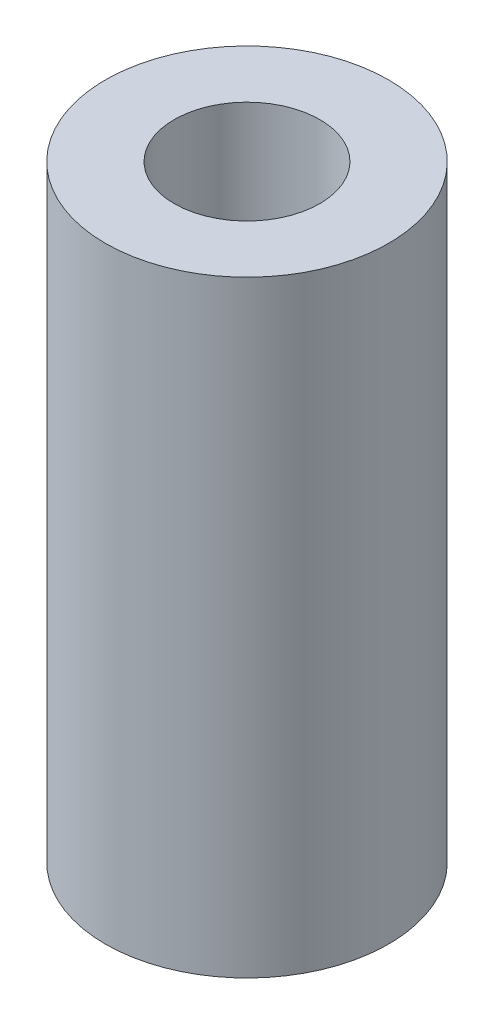
ISO-10303-21;
HEADER;
FILE_DESCRIPTION(('STEP AP214'),'2;1');
FILE_NAME('part.step','',(''),(''),'','','');
FILE_SCHEMA(('AUTOMOTIVE_DESIGN { 1 0 10303 214 1 1 1 1 }'));
ENDSEC;
DATA;
#1=APPLICATION_CONTEXT('core data for automotive mechanical design processes');
#2=APPLICATION_PROTOCOL_DEFINITION('international standard','automotive_design',2000,#1);
#3=PRODUCT_CONTEXT('',#1,'mechanical');
#4=PRODUCT('Part','Part','',(#3));
#5=PRODUCT_RELATED_PRODUCT_CATEGORY('part','',(#4));
#6=PRODUCT_DEFINITION_FORMATION('','',#4);
#7=PRODUCT_DEFINITION_CONTEXT('part definition',#1,'design');
#8=PRODUCT_DEFINITION('design','',#6,#7);
#9=PRODUCT_DEFINITION_SHAPE('','',#8);
#10=(LENGTH_UNIT() NAMED_UNIT(*) SI_UNIT(.MILLI.,.METRE.));
#11=(NAMED_UNIT(*) PLANE_ANGLE_UNIT() SI_UNIT($,.RADIAN.));
#12=(NAMED_UNIT(*) SI_UNIT($,.STERADIAN.) SOLID_ANGLE_UNIT());
#13=UNCERTAINTY_MEASURE_WITH_UNIT(LENGTH_MEASURE(1.E-05),#10,'distance_accuracy_value','');
#14=(GEOMETRIC_REPRESENTATION_CONTEXT(3) GLOBAL_UNCERTAINTY_ASSIGNED_CONTEXT((#13)) GLOBAL_UNIT_ASSIGNED_CONTEXT((#10,
#11,#12)) REPRESENTATION_CONTEXT('',''));
#15=CARTESIAN_POINT('',(0.,0.,0.));
#16=DIRECTION('',(0.,0.,1.));
#17=DIRECTION('',(1.,0.,0.));
#18=AXIS2_PLACEMENT_3D('',#15,#16,#17);
#19=CARTESIAN_POINT('',(0.,7.5,0.));
#20=DIRECTION('',(0.,1.,0.));
#21=DIRECTION('',(0.,0.,1.));
#22=AXIS2_PLACEMENT_3D('',#19,#20,#21);
#23=PLANE('',#22);
#24=CARTESIAN_POINT('',(0.,7.5,0.));
#25=DIRECTION('',(0.,1.,0.));
#26=DIRECTION('',(0.,0.,1.));
#27=AXIS2_PLACEMENT_3D('',#24,#25,#26);
#28=CIRCLE('',#27,3.5);
#29=CARTESIAN_POINT('',(0.,7.5,3.5));
#30=VERTEX_POINT('',#29);
#31=EDGE_CURVE('E10',#30,#30,#28,.T.);
#32=ORIENTED_EDGE('',*,*,#31,.T.);
#33=EDGE_LOOP('',(#32));
#34=FACE_BOUND('',#33,.T.);
#35=CARTESIAN_POINT('',(0.,7.5,0.));
#36=DIRECTION('',(0.,1.,0.));
#37=DIRECTION('',(0.,0.,1.));
#38=AXIS2_PLACEMENT_3D('',#35,#36,#37);
#39=CIRCLE('',#38,1.8);
#40=CARTESIAN_POINT('',(0.,7.5,1.8));
#41=VERTEX_POINT('',#40);
#42=EDGE_CURVE('E43',#41,#41,#39,.T.);
#43=ORIENTED_EDGE('',*,*,#42,.F.);
#44=EDGE_LOOP('',(#43));
#45=FACE_BOUND('',#44,.T.);
#46=ADVANCED_FACE('F32',(#34,#45),#23,.T.);
#47=CARTESIAN_POINT('',(0.,-7.5,0.));
#48=DIRECTION('',(0.,1.,0.));
#49=DIRECTION('',(0.,0.,1.));
#50=AXIS2_PLACEMENT_3D('',#47,#48,#49);
#51=PLANE('',#50);
#52=CARTESIAN_POINT('',(0.,-7.5,0.));
#53=DIRECTION('',(0.,1.,0.));
#54=DIRECTION('',(0.,0.,1.));
#55=AXIS2_PLACEMENT_3D('',#52,#53,#54);
#56=CIRCLE('',#55,3.5);
#57=CARTESIAN_POINT('',(0.,-7.5,3.5));
#58=VERTEX_POINT('',#57);
#59=EDGE_CURVE('E36',#58,#58,#56,.T.);
#60=ORIENTED_EDGE('',*,*,#59,.F.);
#61=EDGE_LOOP('',(#60));
#62=FACE_BOUND('',#61,.T.);
#63=CARTESIAN_POINT('',(0.,-7.5,0.));
#64=DIRECTION('',(0.,1.,0.));
#65=DIRECTION('',(0.,0.,1.));
#66=AXIS2_PLACEMENT_3D('',#63,#64,#65);
#67=CIRCLE('',#66,1.8);
#68=CARTESIAN_POINT('',(0.,-7.5,1.8));
#69=VERTEX_POINT('',#68);
#70=EDGE_CURVE('E45',#69,#69,#67,.T.);
#71=ORIENTED_EDGE('',*,*,#70,.T.);
#72=EDGE_LOOP('',(#71));
#73=FACE_BOUND('',#72,.T.);
#74=ADVANCED_FACE('F55',(#62,#73),#51,.F.);
#75=CARTESIAN_POINT('',(0.,7.5,0.));
#76=DIRECTION('',(0.,-1.,0.));
#77=DIRECTION('',(0.,0.,-1.));
#78=AXIS2_PLACEMENT_3D('',#75,#76,#77);
#79=CYLINDRICAL_SURFACE('',#78,3.5);
#80=ORIENTED_EDGE('',*,*,#31,.F.);
#81=EDGE_LOOP('',(#80));
#82=FACE_BOUND('',#81,.T.);
#83=ORIENTED_EDGE('',*,*,#59,.T.);
#84=EDGE_LOOP('',(#83));
#85=FACE_BOUND('',#84,.T.);
#86=ADVANCED_FACE('F34',(#82,#85),#79,.T.);
#87=CARTESIAN_POINT('',(0.,7.5,0.));
#88=DIRECTION('',(0.,-1.,0.));
#89=DIRECTION('',(0.,0.,-1.));
#90=AXIS2_PLACEMENT_3D('',#87,#88,#89);
#91=CYLINDRICAL_SURFACE('',#90,1.8);
#92=ORIENTED_EDGE('',*,*,#42,.T.);
#93=EDGE_LOOP('',(#92));
#94=FACE_BOUND('',#93,.T.);
#95=ORIENTED_EDGE('',*,*,#70,.F.);
#96=EDGE_LOOP('',(#95));
#97=FACE_BOUND('',#96,.T.);
#98=ADVANCED_FACE('F51',(#94,#97),#91,.F.);
#99=CLOSED_SHELL('',(#46,#74,#86,#98));
#100=MANIFOLD_SOLID_BREP('B2',#99);
#101=ADVANCED_BREP_SHAPE_REPRESENTATION('',(#18,#100),#14);
#102=SHAPE_DEFINITION_REPRESENTATION(#9,#101);
ENDSEC;
END-ISO-10303-21;
